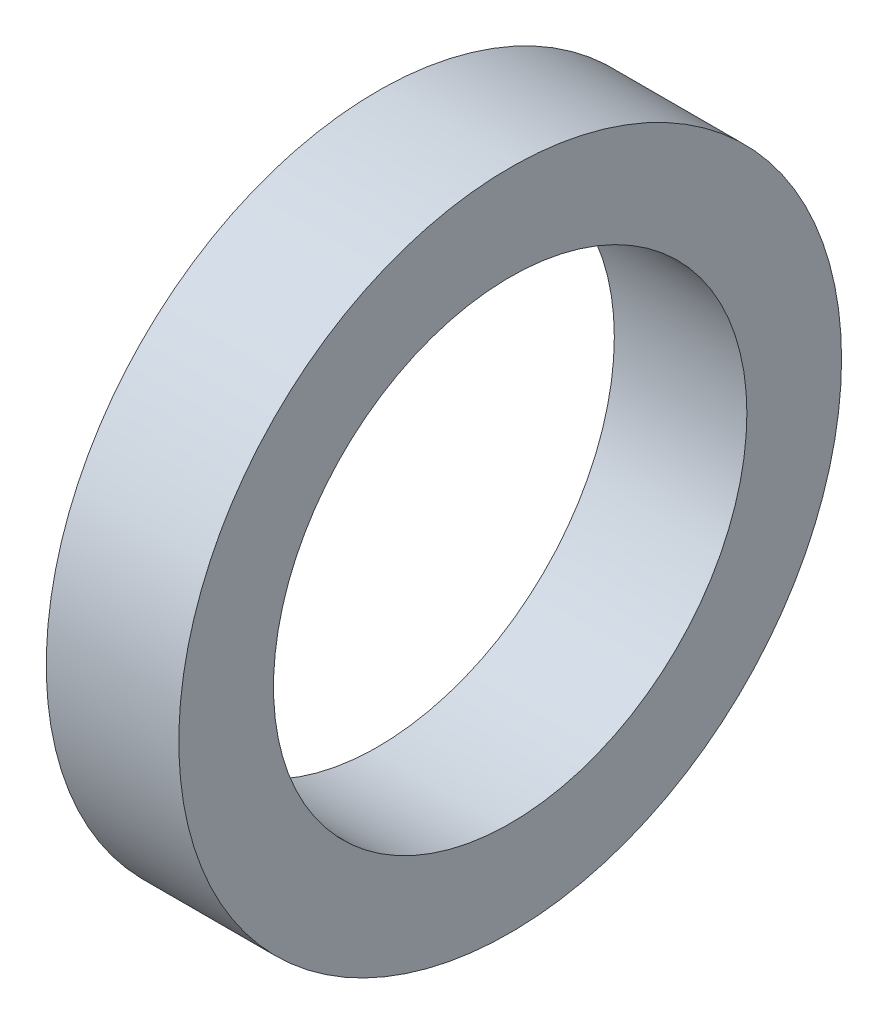
ISO-10303-21;
HEADER;
FILE_DESCRIPTION(('STEP AP214'),'2;1');
FILE_NAME('part.step','',(''),(''),'','','');
FILE_SCHEMA(('AUTOMOTIVE_DESIGN { 1 0 10303 214 1 1 1 1 }'));
ENDSEC;
DATA;
#1=APPLICATION_CONTEXT('core data for automotive mechanical design processes');
#2=APPLICATION_PROTOCOL_DEFINITION('international standard','automotive_design',2000,#1);
#3=PRODUCT_CONTEXT('',#1,'mechanical');
#4=PRODUCT('Part','Part','',(#3));
#5=PRODUCT_RELATED_PRODUCT_CATEGORY('part','',(#4));
#6=PRODUCT_DEFINITION_FORMATION('','',#4);
#7=PRODUCT_DEFINITION_CONTEXT('part definition',#1,'design');
#8=PRODUCT_DEFINITION('design','',#6,#7);
#9=PRODUCT_DEFINITION_SHAPE('','',#8);
#10=(LENGTH_UNIT() NAMED_UNIT(*) SI_UNIT(.MILLI.,.METRE.));
#11=(NAMED_UNIT(*) PLANE_ANGLE_UNIT() SI_UNIT($,.RADIAN.));
#12=(NAMED_UNIT(*) SI_UNIT($,.STERADIAN.) SOLID_ANGLE_UNIT());
#13=UNCERTAINTY_MEASURE_WITH_UNIT(LENGTH_MEASURE(1.E-05),#10,'distance_accuracy_value','');
#14=(GEOMETRIC_REPRESENTATION_CONTEXT(3) GLOBAL_UNCERTAINTY_ASSIGNED_CONTEXT((#13)) GLOBAL_UNIT_ASSIGNED_CONTEXT((#10,
#11,#12)) REPRESENTATION_CONTEXT('',''));
#15=CARTESIAN_POINT('',(0.,0.,0.));
#16=DIRECTION('',(0.,0.,1.));
#17=DIRECTION('',(1.,0.,0.));
#18=AXIS2_PLACEMENT_3D('',#15,#16,#17);
#19=CARTESIAN_POINT('',(24.6296296296296,0.,0.));
#20=DIRECTION('',(1.,0.,0.));
#21=DIRECTION('',(0.,0.,-1.));
#22=AXIS2_PLACEMENT_3D('',#19,#20,#21);
#23=CYLINDRICAL_SURFACE('',#22,12.5);
#24=CARTESIAN_POINT('',(7.,0.,0.));
#25=DIRECTION('',(1.,0.,0.));
#26=DIRECTION('',(0.,0.,-1.));
#27=AXIS2_PLACEMENT_3D('',#24,#25,#26);
#28=CIRCLE('',#27,12.5);
#29=CARTESIAN_POINT('',(7.,0.,-12.5));
#30=VERTEX_POINT('',#29);
#31=EDGE_CURVE('E53',#30,#30,#28,.T.);
#32=ORIENTED_EDGE('',*,*,#31,.T.);
#33=EDGE_LOOP('',(#32));
#34=FACE_BOUND('',#33,.T.);
#35=CARTESIAN_POINT('',(0.,0.,0.));
#36=DIRECTION('',(1.,0.,0.));
#37=DIRECTION('',(0.,0.,-1.));
#38=AXIS2_PLACEMENT_3D('',#35,#36,#37);
#39=CIRCLE('',#38,12.5);
#40=CARTESIAN_POINT('',(0.,0.,-12.5));
#41=VERTEX_POINT('',#40);
#42=EDGE_CURVE('E10',#41,#41,#39,.T.);
#43=ORIENTED_EDGE('',*,*,#42,.F.);
#44=EDGE_LOOP('',(#43));
#45=FACE_BOUND('',#44,.T.);
#46=ADVANCED_FACE('F39',(#34,#45),#23,.F.);
#47=CARTESIAN_POINT('',(0.,12.5,0.));
#48=DIRECTION('',(-1.,0.,0.));
#49=DIRECTION('',(0.,0.,1.));
#50=AXIS2_PLACEMENT_3D('',#47,#48,#49);
#51=PLANE('',#50);
#52=ORIENTED_EDGE('',*,*,#42,.T.);
#53=EDGE_LOOP('',(#52));
#54=FACE_BOUND('',#53,.T.);
#55=CARTESIAN_POINT('',(0.,0.,0.));
#56=DIRECTION('',(1.,0.,0.));
#57=DIRECTION('',(0.,0.,-1.));
#58=AXIS2_PLACEMENT_3D('',#55,#56,#57);
#59=CIRCLE('',#58,17.5);
#60=CARTESIAN_POINT('',(0.,0.,-17.5));
#61=VERTEX_POINT('',#60);
#62=EDGE_CURVE('E45',#61,#61,#59,.T.);
#63=ORIENTED_EDGE('',*,*,#62,.F.);
#64=EDGE_LOOP('',(#63));
#65=FACE_BOUND('',#64,.T.);
#66=ADVANCED_FACE('F69',(#54,#65),#51,.T.);
#67=CARTESIAN_POINT('',(24.6296296296296,0.,0.));
#68=DIRECTION('',(1.,0.,0.));
#69=DIRECTION('',(0.,0.,-1.));
#70=AXIS2_PLACEMENT_3D('',#67,#68,#69);
#71=CYLINDRICAL_SURFACE('',#70,17.5);
#72=ORIENTED_EDGE('',*,*,#62,.T.);
#73=EDGE_LOOP('',(#72));
#74=FACE_BOUND('',#73,.T.);
#75=CARTESIAN_POINT('',(7.,0.,0.));
#76=DIRECTION('',(1.,0.,0.));
#77=DIRECTION('',(0.,0.,-1.));
#78=AXIS2_PLACEMENT_3D('',#75,#76,#77);
#79=CIRCLE('',#78,17.5);
#80=CARTESIAN_POINT('',(7.,0.,-17.5));
#81=VERTEX_POINT('',#80);
#82=EDGE_CURVE('E49',#81,#81,#79,.T.);
#83=ORIENTED_EDGE('',*,*,#82,.F.);
#84=EDGE_LOOP('',(#83));
#85=FACE_BOUND('',#84,.T.);
#86=ADVANCED_FACE('F63',(#74,#85),#71,.T.);
#87=CARTESIAN_POINT('',(7.,17.5,0.));
#88=DIRECTION('',(1.,0.,0.));
#89=DIRECTION('',(0.,0.,-1.));
#90=AXIS2_PLACEMENT_3D('',#87,#88,#89);
#91=PLANE('',#90);
#92=ORIENTED_EDGE('',*,*,#82,.T.);
#93=EDGE_LOOP('',(#92));
#94=FACE_BOUND('',#93,.T.);
#95=ORIENTED_EDGE('',*,*,#31,.F.);
#96=EDGE_LOOP('',(#95));
#97=FACE_BOUND('',#96,.T.);
#98=ADVANCED_FACE('F61',(#94,#97),#91,.T.);
#99=CLOSED_SHELL('',(#46,#66,#86,#98));
#100=MANIFOLD_SOLID_BREP('B2',#99);
#101=ADVANCED_BREP_SHAPE_REPRESENTATION('',(#18,#100),#14);
#102=SHAPE_DEFINITION_REPRESENTATION(#9,#101);
ENDSEC;
END-ISO-10303-21;
